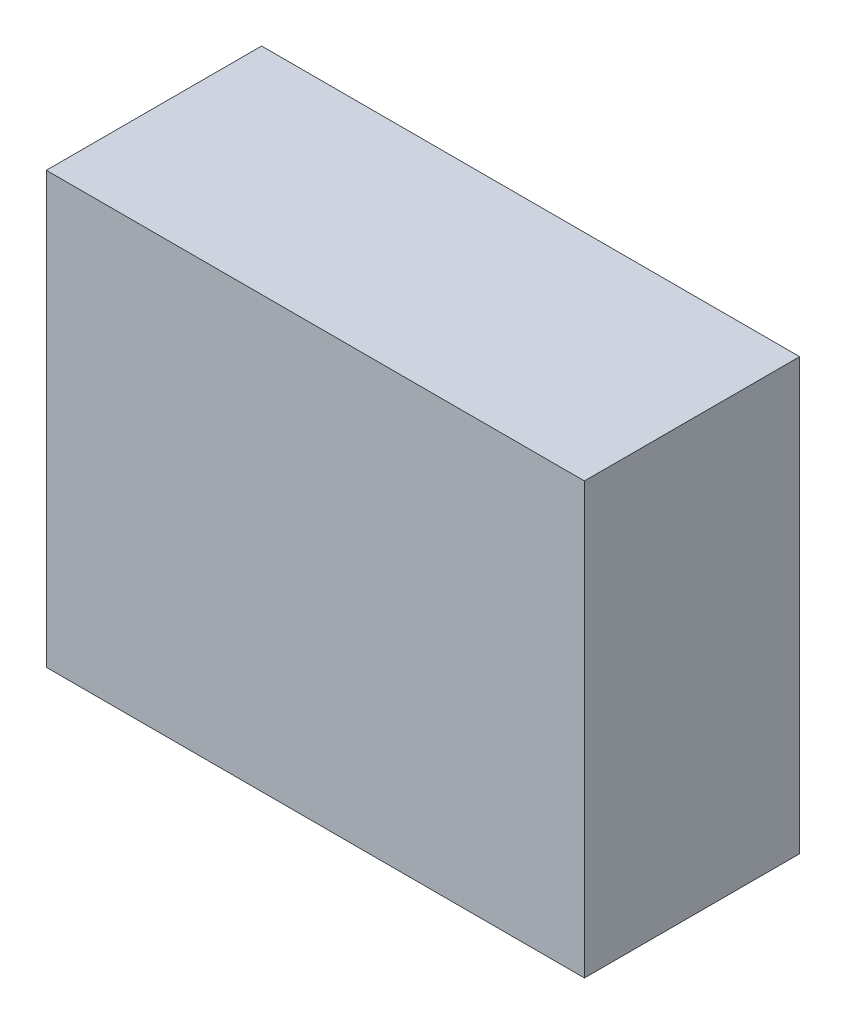
ISO-10303-21;
HEADER;
FILE_DESCRIPTION(('STEP AP214'),'2;1');
FILE_NAME('part.step','',(''),(''),'','','');
FILE_SCHEMA(('AUTOMOTIVE_DESIGN { 1 0 10303 214 1 1 1 1 }'));
ENDSEC;
DATA;
#1=APPLICATION_CONTEXT('core data for automotive mechanical design processes');
#2=APPLICATION_PROTOCOL_DEFINITION('international standard','automotive_design',2000,#1);
#3=PRODUCT_CONTEXT('',#1,'mechanical');
#4=PRODUCT('Part','Part','',(#3));
#5=PRODUCT_RELATED_PRODUCT_CATEGORY('part','',(#4));
#6=PRODUCT_DEFINITION_FORMATION('','',#4);
#7=PRODUCT_DEFINITION_CONTEXT('part definition',#1,'design');
#8=PRODUCT_DEFINITION('design','',#6,#7);
#9=PRODUCT_DEFINITION_SHAPE('','',#8);
#10=(LENGTH_UNIT() NAMED_UNIT(*) SI_UNIT(.MILLI.,.METRE.));
#11=(NAMED_UNIT(*) PLANE_ANGLE_UNIT() SI_UNIT($,.RADIAN.));
#12=(NAMED_UNIT(*) SI_UNIT($,.STERADIAN.) SOLID_ANGLE_UNIT());
#13=UNCERTAINTY_MEASURE_WITH_UNIT(LENGTH_MEASURE(1.E-05),#10,'distance_accuracy_value','');
#14=(GEOMETRIC_REPRESENTATION_CONTEXT(3) GLOBAL_UNCERTAINTY_ASSIGNED_CONTEXT((#13)) GLOBAL_UNIT_ASSIGNED_CONTEXT((#10,
#11,#12)) REPRESENTATION_CONTEXT('',''));
#15=CARTESIAN_POINT('',(0.,0.,0.));
#16=DIRECTION('',(0.,0.,1.));
#17=DIRECTION('',(1.,0.,0.));
#18=AXIS2_PLACEMENT_3D('',#15,#16,#17);
#19=CARTESIAN_POINT('',(-15.,-12.,12.));
#20=DIRECTION('',(1.,0.,0.));
#21=DIRECTION('',(0.,0.,-1.));
#22=AXIS2_PLACEMENT_3D('',#19,#20,#21);
#23=PLANE('',#22);
#24=DIRECTION('',(0.,-1.,0.));
#25=VECTOR('',#24,1.);
#26=CARTESIAN_POINT('',(-15.,-12.,0.));
#27=LINE('',#26,#25);
#28=CARTESIAN_POINT('',(-15.,12.,0.));
#29=VERTEX_POINT('',#28);
#30=CARTESIAN_POINT('',(-15.,-12.,0.));
#31=VERTEX_POINT('',#30);
#32=EDGE_CURVE('E102',#29,#31,#27,.T.);
#33=ORIENTED_EDGE('',*,*,#32,.T.);
#34=DIRECTION('',(0.,0.,-1.));
#35=VECTOR('',#34,1.);
#36=CARTESIAN_POINT('',(-15.,-12.,12.));
#37=LINE('',#36,#35);
#38=CARTESIAN_POINT('',(-15.,-12.,12.));
#39=VERTEX_POINT('',#38);
#40=EDGE_CURVE('E11',#39,#31,#37,.T.);
#41=ORIENTED_EDGE('',*,*,#40,.F.);
#42=DIRECTION('',(0.,-1.,0.));
#43=VECTOR('',#42,1.);
#44=CARTESIAN_POINT('',(-15.,-12.,12.));
#45=LINE('',#44,#43);
#46=CARTESIAN_POINT('',(-15.,12.,12.));
#47=VERTEX_POINT('',#46);
#48=EDGE_CURVE('E90',#47,#39,#45,.T.);
#49=ORIENTED_EDGE('',*,*,#48,.F.);
#50=DIRECTION('',(0.,0.,-1.));
#51=VECTOR('',#50,1.);
#52=CARTESIAN_POINT('',(-15.,12.,12.));
#53=LINE('',#52,#51);
#54=EDGE_CURVE('E98',#47,#29,#53,.T.);
#55=ORIENTED_EDGE('',*,*,#54,.T.);
#56=EDGE_LOOP('',(#33,#41,#49,#55));
#57=FACE_BOUND('',#56,.T.);
#58=ADVANCED_FACE('F39',(#57),#23,.F.);
#59=CARTESIAN_POINT('',(-15.,-12.,12.));
#60=DIRECTION('',(0.,1.,0.));
#61=DIRECTION('',(0.,0.,1.));
#62=AXIS2_PLACEMENT_3D('',#59,#60,#61);
#63=PLANE('',#62);
#64=DIRECTION('',(1.,0.,0.));
#65=VECTOR('',#64,1.);
#66=CARTESIAN_POINT('',(-15.,-12.,0.));
#67=LINE('',#66,#65);
#68=CARTESIAN_POINT('',(15.,-12.,0.));
#69=VERTEX_POINT('',#68);
#70=EDGE_CURVE('E94',#31,#69,#67,.T.);
#71=ORIENTED_EDGE('',*,*,#70,.T.);
#72=DIRECTION('',(0.,0.,-1.));
#73=VECTOR('',#72,1.);
#74=CARTESIAN_POINT('',(15.,-12.,12.));
#75=LINE('',#74,#73);
#76=CARTESIAN_POINT('',(15.,-12.,12.));
#77=VERTEX_POINT('',#76);
#78=EDGE_CURVE('E47',#77,#69,#75,.T.);
#79=ORIENTED_EDGE('',*,*,#78,.F.);
#80=DIRECTION('',(1.,0.,0.));
#81=VECTOR('',#80,1.);
#82=CARTESIAN_POINT('',(-15.,-12.,12.));
#83=LINE('',#82,#81);
#84=EDGE_CURVE('E85',#39,#77,#83,.T.);
#85=ORIENTED_EDGE('',*,*,#84,.F.);
#86=ORIENTED_EDGE('',*,*,#40,.T.);
#87=EDGE_LOOP('',(#71,#79,#85,#86));
#88=FACE_BOUND('',#87,.T.);
#89=ADVANCED_FACE('F93',(#88),#63,.F.);
#90=CARTESIAN_POINT('',(15.,-12.,12.));
#91=DIRECTION('',(-1.,0.,0.));
#92=DIRECTION('',(0.,0.,1.));
#93=AXIS2_PLACEMENT_3D('',#90,#91,#92);
#94=PLANE('',#93);
#95=DIRECTION('',(0.,1.,0.));
#96=VECTOR('',#95,1.);
#97=CARTESIAN_POINT('',(15.,-12.,0.));
#98=LINE('',#97,#96);
#99=CARTESIAN_POINT('',(15.,12.,0.));
#100=VERTEX_POINT('',#99);
#101=EDGE_CURVE('E72',#69,#100,#98,.T.);
#102=ORIENTED_EDGE('',*,*,#101,.T.);
#103=DIRECTION('',(0.,0.,-1.));
#104=VECTOR('',#103,1.);
#105=CARTESIAN_POINT('',(15.,12.,12.));
#106=LINE('',#105,#104);
#107=CARTESIAN_POINT('',(15.,12.,12.));
#108=VERTEX_POINT('',#107);
#109=EDGE_CURVE('E95',#108,#100,#106,.T.);
#110=ORIENTED_EDGE('',*,*,#109,.F.);
#111=DIRECTION('',(0.,1.,0.));
#112=VECTOR('',#111,1.);
#113=CARTESIAN_POINT('',(15.,-12.,12.));
#114=LINE('',#113,#112);
#115=EDGE_CURVE('E88',#77,#108,#114,.T.);
#116=ORIENTED_EDGE('',*,*,#115,.F.);
#117=ORIENTED_EDGE('',*,*,#78,.T.);
#118=EDGE_LOOP('',(#102,#110,#116,#117));
#119=FACE_BOUND('',#118,.T.);
#120=ADVANCED_FACE('F96',(#119),#94,.F.);
#121=CARTESIAN_POINT('',(-15.,12.,12.));
#122=DIRECTION('',(0.,-1.,0.));
#123=DIRECTION('',(0.,0.,-1.));
#124=AXIS2_PLACEMENT_3D('',#121,#122,#123);
#125=PLANE('',#124);
#126=DIRECTION('',(-1.,0.,0.));
#127=VECTOR('',#126,1.);
#128=CARTESIAN_POINT('',(-15.,12.,0.));
#129=LINE('',#128,#127);
#130=EDGE_CURVE('E78',#100,#29,#129,.T.);
#131=ORIENTED_EDGE('',*,*,#130,.T.);
#132=ORIENTED_EDGE('',*,*,#54,.F.);
#133=DIRECTION('',(-1.,0.,0.));
#134=VECTOR('',#133,1.);
#135=CARTESIAN_POINT('',(-15.,12.,12.));
#136=LINE('',#135,#134);
#137=EDGE_CURVE('E55',#108,#47,#136,.T.);
#138=ORIENTED_EDGE('',*,*,#137,.F.);
#139=ORIENTED_EDGE('',*,*,#109,.T.);
#140=EDGE_LOOP('',(#131,#132,#138,#139));
#141=FACE_BOUND('',#140,.T.);
#142=ADVANCED_FACE('F109',(#141),#125,.F.);
#143=CARTESIAN_POINT('',(0.,0.,12.));
#144=DIRECTION('',(0.,0.,-1.));
#145=DIRECTION('',(-1.,0.,0.));
#146=AXIS2_PLACEMENT_3D('',#143,#144,#145);
#147=PLANE('',#146);
#148=ORIENTED_EDGE('',*,*,#48,.T.);
#149=ORIENTED_EDGE('',*,*,#84,.T.);
#150=ORIENTED_EDGE('',*,*,#115,.T.);
#151=ORIENTED_EDGE('',*,*,#137,.T.);
#152=EDGE_LOOP('',(#148,#149,#150,#151));
#153=FACE_BOUND('',#152,.T.);
#154=ADVANCED_FACE('F86',(#153),#147,.F.);
#155=CARTESIAN_POINT('',(0.,0.,0.));
#156=DIRECTION('',(0.,0.,-1.));
#157=DIRECTION('',(-1.,0.,0.));
#158=AXIS2_PLACEMENT_3D('',#155,#156,#157);
#159=PLANE('',#158);
#160=ORIENTED_EDGE('',*,*,#32,.F.);
#161=ORIENTED_EDGE('',*,*,#130,.F.);
#162=ORIENTED_EDGE('',*,*,#101,.F.);
#163=ORIENTED_EDGE('',*,*,#70,.F.);
#164=EDGE_LOOP('',(#160,#161,#162,#163));
#165=FACE_BOUND('',#164,.T.);
#166=ADVANCED_FACE('F112',(#165),#159,.T.);
#167=CLOSED_SHELL('',(#58,#89,#120,#142,#154,#166));
#168=MANIFOLD_SOLID_BREP('B2',#167);
#169=ADVANCED_BREP_SHAPE_REPRESENTATION('',(#18,#168),#14);
#170=SHAPE_DEFINITION_REPRESENTATION(#9,#169);
ENDSEC;
END-ISO-10303-21;
